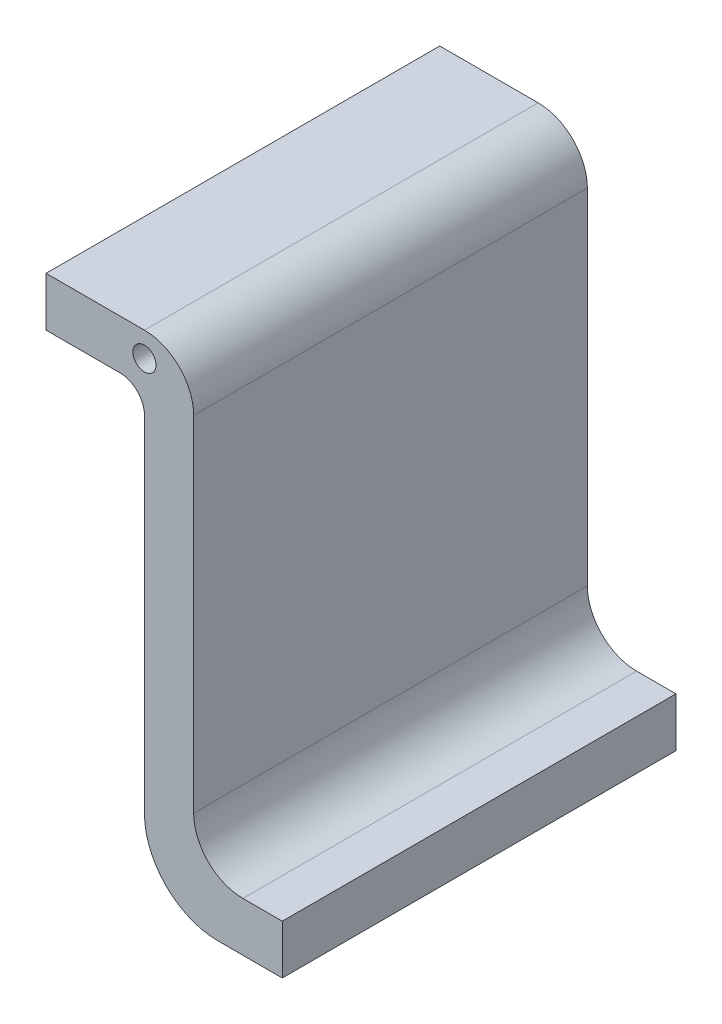
ISO-10303-21;
HEADER;
FILE_DESCRIPTION(('STEP AP214'),'2;1');
FILE_NAME('part.step','',(''),(''),'','','');
FILE_SCHEMA(('AUTOMOTIVE_DESIGN { 1 0 10303 214 1 1 1 1 }'));
ENDSEC;
DATA;
#1=APPLICATION_CONTEXT('core data for automotive mechanical design processes');
#2=APPLICATION_PROTOCOL_DEFINITION('international standard','automotive_design',2000,#1);
#3=PRODUCT_CONTEXT('',#1,'mechanical');
#4=PRODUCT('Part','Part','',(#3));
#5=PRODUCT_RELATED_PRODUCT_CATEGORY('part','',(#4));
#6=PRODUCT_DEFINITION_FORMATION('','',#4);
#7=PRODUCT_DEFINITION_CONTEXT('part definition',#1,'design');
#8=PRODUCT_DEFINITION('design','',#6,#7);
#9=PRODUCT_DEFINITION_SHAPE('','',#8);
#10=(LENGTH_UNIT() NAMED_UNIT(*) SI_UNIT(.MILLI.,.METRE.));
#11=(NAMED_UNIT(*) PLANE_ANGLE_UNIT() SI_UNIT($,.RADIAN.));
#12=(NAMED_UNIT(*) SI_UNIT($,.STERADIAN.) SOLID_ANGLE_UNIT());
#13=UNCERTAINTY_MEASURE_WITH_UNIT(LENGTH_MEASURE(1.E-05),#10,'distance_accuracy_value','');
#14=(GEOMETRIC_REPRESENTATION_CONTEXT(3) GLOBAL_UNCERTAINTY_ASSIGNED_CONTEXT((#13)) GLOBAL_UNIT_ASSIGNED_CONTEXT((#10,
#11,#12)) REPRESENTATION_CONTEXT('',''));
#15=CARTESIAN_POINT('',(0.,0.,0.));
#16=DIRECTION('',(0.,0.,1.));
#17=DIRECTION('',(1.,0.,0.));
#18=AXIS2_PLACEMENT_3D('',#15,#16,#17);
#19=CARTESIAN_POINT('',(0.,-10.,-80.));
#20=DIRECTION('',(-1.,0.,0.));
#21=DIRECTION('',(0.,0.,1.));
#22=AXIS2_PLACEMENT_3D('',#19,#20,#21);
#23=PLANE('',#22);
#24=DIRECTION('',(0.,-1.,0.));
#25=VECTOR('',#24,1.);
#26=CARTESIAN_POINT('',(0.,-10.,0.));
#27=LINE('',#26,#25);
#28=CARTESIAN_POINT('',(0.,0.,0.));
#29=VERTEX_POINT('',#28);
#30=CARTESIAN_POINT('',(0.,-10.,0.));
#31=VERTEX_POINT('',#30);
#32=EDGE_CURVE('E198',#29,#31,#27,.T.);
#33=ORIENTED_EDGE('',*,*,#32,.F.);
#34=DIRECTION('',(0.,0.,1.));
#35=VECTOR('',#34,1.);
#36=CARTESIAN_POINT('',(0.,0.,-80.));
#37=LINE('',#36,#35);
#38=CARTESIAN_POINT('',(0.,0.,-80.));
#39=VERTEX_POINT('',#38);
#40=EDGE_CURVE('E159',#39,#29,#37,.T.);
#41=ORIENTED_EDGE('',*,*,#40,.F.);
#42=DIRECTION('',(0.,-1.,0.));
#43=VECTOR('',#42,1.);
#44=CARTESIAN_POINT('',(0.,-10.,-80.));
#45=LINE('',#44,#43);
#46=CARTESIAN_POINT('',(0.,-10.,-80.));
#47=VERTEX_POINT('',#46);
#48=EDGE_CURVE('E153',#39,#47,#45,.T.);
#49=ORIENTED_EDGE('',*,*,#48,.T.);
#50=DIRECTION('',(0.,0.,1.));
#51=VECTOR('',#50,1.);
#52=CARTESIAN_POINT('',(0.,-10.,-80.));
#53=LINE('',#52,#51);
#54=EDGE_CURVE('E133',#47,#31,#53,.T.);
#55=ORIENTED_EDGE('',*,*,#54,.T.);
#56=EDGE_LOOP('',(#33,#41,#49,#55));
#57=FACE_BOUND('',#56,.T.);
#58=ADVANCED_FACE('F45',(#57),#23,.T.);
#59=CARTESIAN_POINT('',(0.,0.,-80.));
#60=DIRECTION('',(0.,1.,0.));
#61=DIRECTION('',(0.,0.,1.));
#62=AXIS2_PLACEMENT_3D('',#59,#60,#61);
#63=PLANE('',#62);
#64=DIRECTION('',(-1.,0.,0.));
#65=VECTOR('',#64,1.);
#66=CARTESIAN_POINT('',(0.,0.,0.));
#67=LINE('',#66,#65);
#68=CARTESIAN_POINT('',(19.9999999999999,0.,0.));
#69=VERTEX_POINT('',#68);
#70=EDGE_CURVE('E161',#69,#29,#67,.T.);
#71=ORIENTED_EDGE('',*,*,#70,.F.);
#72=DIRECTION('',(0.,0.,1.));
#73=VECTOR('',#72,1.);
#74=CARTESIAN_POINT('',(19.9999999999999,0.,-80.));
#75=LINE('',#74,#73);
#76=CARTESIAN_POINT('',(19.9999999999999,0.,-80.));
#77=VERTEX_POINT('',#76);
#78=EDGE_CURVE('E232',#77,#69,#75,.T.);
#79=ORIENTED_EDGE('',*,*,#78,.F.);
#80=DIRECTION('',(-1.,0.,0.));
#81=VECTOR('',#80,1.);
#82=CARTESIAN_POINT('',(0.,0.,-80.));
#83=LINE('',#82,#81);
#84=EDGE_CURVE('E146',#77,#39,#83,.T.);
#85=ORIENTED_EDGE('',*,*,#84,.T.);
#86=ORIENTED_EDGE('',*,*,#40,.T.);
#87=EDGE_LOOP('',(#71,#79,#85,#86));
#88=FACE_BOUND('',#87,.T.);
#89=ADVANCED_FACE('F273',(#88),#63,.T.);
#90=CARTESIAN_POINT('',(20.,-10.,-80.));
#91=DIRECTION('',(0.,0.,1.));
#92=DIRECTION('',(1.,0.,0.));
#93=AXIS2_PLACEMENT_3D('',#90,#91,#92);
#94=CYLINDRICAL_SURFACE('',#93,10.);
#95=CARTESIAN_POINT('',(20.,-10.,0.));
#96=DIRECTION('',(0.,0.,1.));
#97=DIRECTION('',(-1.,0.,0.));
#98=AXIS2_PLACEMENT_3D('',#95,#96,#97);
#99=CIRCLE('',#98,10.);
#100=CARTESIAN_POINT('',(30.,-10.0000000000001,0.));
#101=VERTEX_POINT('',#100);
#102=EDGE_CURVE('E165',#101,#69,#99,.T.);
#103=ORIENTED_EDGE('',*,*,#102,.F.);
#104=DIRECTION('',(0.,0.,1.));
#105=VECTOR('',#104,1.);
#106=CARTESIAN_POINT('',(30.,-10.0000000000001,-80.));
#107=LINE('',#106,#105);
#108=CARTESIAN_POINT('',(30.,-10.0000000000001,-80.));
#109=VERTEX_POINT('',#108);
#110=EDGE_CURVE('E235',#109,#101,#107,.T.);
#111=ORIENTED_EDGE('',*,*,#110,.F.);
#112=CARTESIAN_POINT('',(20.,-10.,-80.));
#113=DIRECTION('',(0.,0.,1.));
#114=DIRECTION('',(-1.,0.,0.));
#115=AXIS2_PLACEMENT_3D('',#112,#113,#114);
#116=CIRCLE('',#115,10.);
#117=EDGE_CURVE('E192',#109,#77,#116,.T.);
#118=ORIENTED_EDGE('',*,*,#117,.T.);
#119=ORIENTED_EDGE('',*,*,#78,.T.);
#120=EDGE_LOOP('',(#103,#111,#118,#119));
#121=FACE_BOUND('',#120,.T.);
#122=ADVANCED_FACE('F312',(#121),#94,.T.);
#123=CARTESIAN_POINT('',(30.,-10.0000000000001,-80.));
#124=DIRECTION('',(1.,0.,0.));
#125=DIRECTION('',(0.,1.,0.));
#126=AXIS2_PLACEMENT_3D('',#123,#124,#125);
#127=PLANE('',#126);
#128=DIRECTION('',(0.,1.,0.));
#129=VECTOR('',#128,1.);
#130=CARTESIAN_POINT('',(30.,-10.0000000000001,0.));
#131=LINE('',#130,#129);
#132=CARTESIAN_POINT('',(30.,-80.,0.));
#133=VERTEX_POINT('',#132);
#134=EDGE_CURVE('E222',#133,#101,#131,.T.);
#135=ORIENTED_EDGE('',*,*,#134,.F.);
#136=DIRECTION('',(0.,0.,1.));
#137=VECTOR('',#136,1.);
#138=CARTESIAN_POINT('',(30.,-80.,-80.));
#139=LINE('',#138,#137);
#140=CARTESIAN_POINT('',(30.,-80.,-80.));
#141=VERTEX_POINT('',#140);
#142=EDGE_CURVE('E238',#141,#133,#139,.T.);
#143=ORIENTED_EDGE('',*,*,#142,.F.);
#144=DIRECTION('',(0.,1.,0.));
#145=VECTOR('',#144,1.);
#146=CARTESIAN_POINT('',(30.,-10.0000000000001,-80.));
#147=LINE('',#146,#145);
#148=EDGE_CURVE('E188',#141,#109,#147,.T.);
#149=ORIENTED_EDGE('',*,*,#148,.T.);
#150=ORIENTED_EDGE('',*,*,#110,.T.);
#151=EDGE_LOOP('',(#135,#143,#149,#150));
#152=FACE_BOUND('',#151,.T.);
#153=ADVANCED_FACE('F280',(#152),#127,.T.);
#154=CARTESIAN_POINT('',(40.,-80.,-80.));
#155=DIRECTION('',(0.,0.,1.));
#156=DIRECTION('',(1.,0.,0.));
#157=AXIS2_PLACEMENT_3D('',#154,#155,#156);
#158=CYLINDRICAL_SURFACE('',#157,9.99999999999999);
#159=CARTESIAN_POINT('',(40.,-80.,0.));
#160=DIRECTION('',(0.,0.,-1.));
#161=DIRECTION('',(1.,0.,0.));
#162=AXIS2_PLACEMENT_3D('',#159,#160,#161);
#163=CIRCLE('',#162,9.99999999999999);
#164=CARTESIAN_POINT('',(40.,-90.,0.));
#165=VERTEX_POINT('',#164);
#166=EDGE_CURVE('E218',#165,#133,#163,.T.);
#167=ORIENTED_EDGE('',*,*,#166,.F.);
#168=DIRECTION('',(0.,0.,1.));
#169=VECTOR('',#168,1.);
#170=CARTESIAN_POINT('',(40.,-90.,-80.));
#171=LINE('',#170,#169);
#172=CARTESIAN_POINT('',(40.,-90.,-80.));
#173=VERTEX_POINT('',#172);
#174=EDGE_CURVE('E241',#173,#165,#171,.T.);
#175=ORIENTED_EDGE('',*,*,#174,.F.);
#176=CARTESIAN_POINT('',(40.,-80.,-80.));
#177=DIRECTION('',(0.,0.,-1.));
#178=DIRECTION('',(1.,0.,0.));
#179=AXIS2_PLACEMENT_3D('',#176,#177,#178);
#180=CIRCLE('',#179,9.99999999999999);
#181=EDGE_CURVE('E184',#173,#141,#180,.T.);
#182=ORIENTED_EDGE('',*,*,#181,.T.);
#183=ORIENTED_EDGE('',*,*,#142,.T.);
#184=EDGE_LOOP('',(#167,#175,#182,#183));
#185=FACE_BOUND('',#184,.T.);
#186=ADVANCED_FACE('F283',(#185),#158,.F.);
#187=CARTESIAN_POINT('',(40.,-90.,-80.));
#188=DIRECTION('',(0.,1.,0.));
#189=DIRECTION('',(0.,0.,1.));
#190=AXIS2_PLACEMENT_3D('',#187,#188,#189);
#191=PLANE('',#190);
#192=DIRECTION('',(-1.,0.,0.));
#193=VECTOR('',#192,1.);
#194=CARTESIAN_POINT('',(40.,-90.,0.));
#195=LINE('',#194,#193);
#196=CARTESIAN_POINT('',(48.,-90.,0.));
#197=VERTEX_POINT('',#196);
#198=EDGE_CURVE('E214',#197,#165,#195,.T.);
#199=ORIENTED_EDGE('',*,*,#198,.F.);
#200=DIRECTION('',(0.,0.,1.));
#201=VECTOR('',#200,1.);
#202=CARTESIAN_POINT('',(48.,-90.,-80.));
#203=LINE('',#202,#201);
#204=CARTESIAN_POINT('',(48.,-90.,-80.));
#205=VERTEX_POINT('',#204);
#206=EDGE_CURVE('E244',#205,#197,#203,.T.);
#207=ORIENTED_EDGE('',*,*,#206,.F.);
#208=DIRECTION('',(-1.,0.,0.));
#209=VECTOR('',#208,1.);
#210=CARTESIAN_POINT('',(40.,-90.,-80.));
#211=LINE('',#210,#209);
#212=EDGE_CURVE('E180',#205,#173,#211,.T.);
#213=ORIENTED_EDGE('',*,*,#212,.T.);
#214=ORIENTED_EDGE('',*,*,#174,.T.);
#215=EDGE_LOOP('',(#199,#207,#213,#214));
#216=FACE_BOUND('',#215,.T.);
#217=ADVANCED_FACE('F288',(#216),#191,.T.);
#218=CARTESIAN_POINT('',(48.,-100.,-80.));
#219=DIRECTION('',(1.,0.,0.));
#220=DIRECTION('',(0.,0.,-1.));
#221=AXIS2_PLACEMENT_3D('',#218,#219,#220);
#222=PLANE('',#221);
#223=DIRECTION('',(0.,1.,0.));
#224=VECTOR('',#223,1.);
#225=CARTESIAN_POINT('',(48.,-100.,0.));
#226=LINE('',#225,#224);
#227=CARTESIAN_POINT('',(48.,-100.,0.));
#228=VERTEX_POINT('',#227);
#229=EDGE_CURVE('E210',#228,#197,#226,.T.);
#230=ORIENTED_EDGE('',*,*,#229,.F.);
#231=DIRECTION('',(0.,0.,1.));
#232=VECTOR('',#231,1.);
#233=CARTESIAN_POINT('',(48.,-100.,-80.));
#234=LINE('',#233,#232);
#235=CARTESIAN_POINT('',(48.,-100.,-80.));
#236=VERTEX_POINT('',#235);
#237=EDGE_CURVE('E145',#236,#228,#234,.T.);
#238=ORIENTED_EDGE('',*,*,#237,.F.);
#239=DIRECTION('',(0.,1.,0.));
#240=VECTOR('',#239,1.);
#241=CARTESIAN_POINT('',(48.,-100.,-80.));
#242=LINE('',#241,#240);
#243=EDGE_CURVE('E176',#236,#205,#242,.T.);
#244=ORIENTED_EDGE('',*,*,#243,.T.);
#245=ORIENTED_EDGE('',*,*,#206,.T.);
#246=EDGE_LOOP('',(#230,#238,#244,#245));
#247=FACE_BOUND('',#246,.T.);
#248=ADVANCED_FACE('F291',(#247),#222,.T.);
#249=CARTESIAN_POINT('',(48.,-100.,-80.));
#250=DIRECTION('',(0.,-1.,0.));
#251=DIRECTION('',(0.,0.,-1.));
#252=AXIS2_PLACEMENT_3D('',#249,#250,#251);
#253=PLANE('',#252);
#254=DIRECTION('',(1.,0.,0.));
#255=VECTOR('',#254,1.);
#256=CARTESIAN_POINT('',(48.,-100.,0.));
#257=LINE('',#256,#255);
#258=CARTESIAN_POINT('',(35.,-100.,0.));
#259=VERTEX_POINT('',#258);
#260=EDGE_CURVE('E207',#259,#228,#257,.T.);
#261=ORIENTED_EDGE('',*,*,#260,.F.);
#262=DIRECTION('',(0.,0.,1.));
#263=VECTOR('',#262,1.);
#264=CARTESIAN_POINT('',(35.,-100.,-80.));
#265=LINE('',#264,#263);
#266=CARTESIAN_POINT('',(35.,-100.,-80.));
#267=VERTEX_POINT('',#266);
#268=EDGE_CURVE('E256',#259,#267,#265,.F.);
#269=ORIENTED_EDGE('',*,*,#268,.T.);
#270=DIRECTION('',(1.,0.,0.));
#271=VECTOR('',#270,1.);
#272=CARTESIAN_POINT('',(48.,-100.,-80.));
#273=LINE('',#272,#271);
#274=EDGE_CURVE('E173',#267,#236,#273,.T.);
#275=ORIENTED_EDGE('',*,*,#274,.T.);
#276=ORIENTED_EDGE('',*,*,#237,.T.);
#277=EDGE_LOOP('',(#261,#269,#275,#276));
#278=FACE_BOUND('',#277,.T.);
#279=ADVANCED_FACE('F319',(#278),#253,.T.);
#280=CARTESIAN_POINT('',(20.,-100.,-80.));
#281=DIRECTION('',(-1.,0.,0.));
#282=DIRECTION('',(0.,-1.,0.));
#283=AXIS2_PLACEMENT_3D('',#280,#281,#282);
#284=PLANE('',#283);
#285=DIRECTION('',(0.,-1.,0.));
#286=VECTOR('',#285,1.);
#287=CARTESIAN_POINT('',(20.,-100.,0.));
#288=LINE('',#287,#286);
#289=CARTESIAN_POINT('',(20.,-15.,0.));
#290=VERTEX_POINT('',#289);
#291=CARTESIAN_POINT('',(20.,-85.,0.));
#292=VERTEX_POINT('',#291);
#293=EDGE_CURVE('E204',#290,#292,#288,.T.);
#294=ORIENTED_EDGE('',*,*,#293,.F.);
#295=DIRECTION('',(0.,0.,1.));
#296=VECTOR('',#295,1.);
#297=CARTESIAN_POINT('',(20.,-15.,-80.));
#298=LINE('',#297,#296);
#299=CARTESIAN_POINT('',(20.,-15.,-80.));
#300=VERTEX_POINT('',#299);
#301=EDGE_CURVE('E67',#290,#300,#298,.F.);
#302=ORIENTED_EDGE('',*,*,#301,.T.);
#303=DIRECTION('',(0.,-1.,0.));
#304=VECTOR('',#303,1.);
#305=CARTESIAN_POINT('',(20.,-100.,-80.));
#306=LINE('',#305,#304);
#307=CARTESIAN_POINT('',(20.,-85.,-80.));
#308=VERTEX_POINT('',#307);
#309=EDGE_CURVE('E157',#300,#308,#306,.T.);
#310=ORIENTED_EDGE('',*,*,#309,.T.);
#311=DIRECTION('',(0.,0.,1.));
#312=VECTOR('',#311,1.);
#313=CARTESIAN_POINT('',(20.,-85.,-80.));
#314=LINE('',#313,#312);
#315=EDGE_CURVE('E231',#308,#292,#314,.T.);
#316=ORIENTED_EDGE('',*,*,#315,.T.);
#317=EDGE_LOOP('',(#294,#302,#310,#316));
#318=FACE_BOUND('',#317,.T.);
#319=ADVANCED_FACE('F300',(#318),#284,.T.);
#320=CARTESIAN_POINT('',(20.,-10.,-80.));
#321=DIRECTION('',(0.,-1.,0.));
#322=DIRECTION('',(1.,0.,0.));
#323=AXIS2_PLACEMENT_3D('',#320,#321,#322);
#324=PLANE('',#323);
#325=DIRECTION('',(1.,0.,0.));
#326=VECTOR('',#325,1.);
#327=CARTESIAN_POINT('',(20.,-10.,-80.));
#328=LINE('',#327,#326);
#329=CARTESIAN_POINT('',(15.,-10.,-80.));
#330=VERTEX_POINT('',#329);
#331=EDGE_CURVE('E137',#47,#330,#328,.T.);
#332=ORIENTED_EDGE('',*,*,#331,.T.);
#333=DIRECTION('',(0.,0.,1.));
#334=VECTOR('',#333,1.);
#335=CARTESIAN_POINT('',(15.,-10.,0.));
#336=LINE('',#335,#334);
#337=CARTESIAN_POINT('',(15.,-10.,0.));
#338=VERTEX_POINT('',#337);
#339=EDGE_CURVE('E263',#330,#338,#336,.T.);
#340=ORIENTED_EDGE('',*,*,#339,.T.);
#341=DIRECTION('',(1.,0.,0.));
#342=VECTOR('',#341,1.);
#343=CARTESIAN_POINT('',(20.,-10.,0.));
#344=LINE('',#343,#342);
#345=EDGE_CURVE('E139',#31,#338,#344,.T.);
#346=ORIENTED_EDGE('',*,*,#345,.F.);
#347=ORIENTED_EDGE('',*,*,#54,.F.);
#348=EDGE_LOOP('',(#332,#340,#346,#347));
#349=FACE_BOUND('',#348,.T.);
#350=ADVANCED_FACE('F135',(#349),#324,.T.);
#351=CARTESIAN_POINT('',(20.,-10.,-80.));
#352=DIRECTION('',(0.,0.,-1.));
#353=DIRECTION('',(-1.,0.,0.));
#354=AXIS2_PLACEMENT_3D('',#351,#352,#353);
#355=PLANE('',#354);
#356=CARTESIAN_POINT('',(20.,-5.,-80.));
#357=DIRECTION('',(0.,0.,-1.));
#358=DIRECTION('',(-1.,0.,0.));
#359=AXIS2_PLACEMENT_3D('',#356,#357,#358);
#360=CIRCLE('',#359,2.35);
#361=CARTESIAN_POINT('',(17.65,-5.,-80.));
#362=VERTEX_POINT('',#361);
#363=EDGE_CURVE('E357',#362,#362,#360,.T.);
#364=ORIENTED_EDGE('',*,*,#363,.F.);
#365=EDGE_LOOP('',(#364));
#366=FACE_BOUND('',#365,.T.);
#367=ORIENTED_EDGE('',*,*,#274,.F.);
#368=CARTESIAN_POINT('',(35.,-85.,-80.));
#369=DIRECTION('',(0.,0.,-1.));
#370=DIRECTION('',(-1.,0.,0.));
#371=AXIS2_PLACEMENT_3D('',#368,#369,#370);
#372=CIRCLE('',#371,15.);
#373=EDGE_CURVE('E259',#267,#308,#372,.T.);
#374=ORIENTED_EDGE('',*,*,#373,.T.);
#375=ORIENTED_EDGE('',*,*,#309,.F.);
#376=CARTESIAN_POINT('',(15.,-15.,-80.));
#377=DIRECTION('',(0.,0.,-1.));
#378=DIRECTION('',(-1.,0.,0.));
#379=AXIS2_PLACEMENT_3D('',#376,#377,#378);
#380=CIRCLE('',#379,5.);
#381=EDGE_CURVE('E11',#300,#330,#380,.F.);
#382=ORIENTED_EDGE('',*,*,#381,.T.);
#383=ORIENTED_EDGE('',*,*,#331,.F.);
#384=ORIENTED_EDGE('',*,*,#48,.F.);
#385=ORIENTED_EDGE('',*,*,#84,.F.);
#386=ORIENTED_EDGE('',*,*,#117,.F.);
#387=ORIENTED_EDGE('',*,*,#148,.F.);
#388=ORIENTED_EDGE('',*,*,#181,.F.);
#389=ORIENTED_EDGE('',*,*,#212,.F.);
#390=ORIENTED_EDGE('',*,*,#243,.F.);
#391=EDGE_LOOP('',(#367,#374,#375,#382,#383,#384,#385,#386,#387,#388,#389,#390));
#392=FACE_BOUND('',#391,.T.);
#393=ADVANCED_FACE('F151',(#366,#392),#355,.T.);
#394=CARTESIAN_POINT('',(20.,-10.,0.));
#395=DIRECTION('',(0.,0.,-1.));
#396=DIRECTION('',(-1.,0.,0.));
#397=AXIS2_PLACEMENT_3D('',#394,#395,#396);
#398=PLANE('',#397);
#399=CARTESIAN_POINT('',(20.,-5.,0.));
#400=DIRECTION('',(0.,0.,1.));
#401=DIRECTION('',(1.,0.,0.));
#402=AXIS2_PLACEMENT_3D('',#399,#400,#401);
#403=CIRCLE('',#402,2.35);
#404=CARTESIAN_POINT('',(22.35,-5.,0.));
#405=VERTEX_POINT('',#404);
#406=EDGE_CURVE('E168',#405,#405,#403,.T.);
#407=ORIENTED_EDGE('',*,*,#406,.F.);
#408=EDGE_LOOP('',(#407));
#409=FACE_BOUND('',#408,.T.);
#410=ORIENTED_EDGE('',*,*,#345,.T.);
#411=CARTESIAN_POINT('',(15.,-15.,0.));
#412=DIRECTION('',(0.,0.,-1.));
#413=DIRECTION('',(-1.,0.,0.));
#414=AXIS2_PLACEMENT_3D('',#411,#412,#413);
#415=CIRCLE('',#414,5.);
#416=EDGE_CURVE('E54',#338,#290,#415,.T.);
#417=ORIENTED_EDGE('',*,*,#416,.T.);
#418=ORIENTED_EDGE('',*,*,#293,.T.);
#419=CARTESIAN_POINT('',(35.,-85.,0.));
#420=DIRECTION('',(0.,0.,-1.));
#421=DIRECTION('',(-1.,0.,0.));
#422=AXIS2_PLACEMENT_3D('',#419,#420,#421);
#423=CIRCLE('',#422,15.);
#424=EDGE_CURVE('E253',#292,#259,#423,.F.);
#425=ORIENTED_EDGE('',*,*,#424,.T.);
#426=ORIENTED_EDGE('',*,*,#260,.T.);
#427=ORIENTED_EDGE('',*,*,#229,.T.);
#428=ORIENTED_EDGE('',*,*,#198,.T.);
#429=ORIENTED_EDGE('',*,*,#166,.T.);
#430=ORIENTED_EDGE('',*,*,#134,.T.);
#431=ORIENTED_EDGE('',*,*,#102,.T.);
#432=ORIENTED_EDGE('',*,*,#70,.T.);
#433=ORIENTED_EDGE('',*,*,#32,.T.);
#434=EDGE_LOOP('',(#410,#417,#418,#425,#426,#427,#428,#429,#430,#431,#432,#433));
#435=FACE_BOUND('',#434,.T.);
#436=ADVANCED_FACE('F269',(#409,#435),#398,.F.);
#437=CARTESIAN_POINT('',(20.,-5.,-5.));
#438=DIRECTION('',(0.,0.,1.));
#439=DIRECTION('',(1.,0.,0.));
#440=AXIS2_PLACEMENT_3D('',#437,#438,#439);
#441=CYLINDRICAL_SURFACE('',#440,2.35);
#442=CARTESIAN_POINT('',(20.,-5.,-5.));
#443=DIRECTION('',(0.,0.,1.));
#444=DIRECTION('',(1.,0.,0.));
#445=AXIS2_PLACEMENT_3D('',#442,#443,#444);
#446=CIRCLE('',#445,2.35);
#447=CARTESIAN_POINT('',(22.35,-5.,-5.));
#448=VERTEX_POINT('',#447);
#449=EDGE_CURVE('E201',#448,#448,#446,.T.);
#450=ORIENTED_EDGE('',*,*,#449,.F.);
#451=EDGE_LOOP('',(#450));
#452=FACE_BOUND('',#451,.T.);
#453=ORIENTED_EDGE('',*,*,#406,.T.);
#454=EDGE_LOOP('',(#453));
#455=FACE_BOUND('',#454,.T.);
#456=ADVANCED_FACE('F333',(#452,#455),#441,.F.);
#457=CARTESIAN_POINT('',(20.,-5.,-5.));
#458=DIRECTION('',(0.,0.,1.));
#459=DIRECTION('',(1.,0.,0.));
#460=AXIS2_PLACEMENT_3D('',#457,#458,#459);
#461=PLANE('',#460);
#462=ORIENTED_EDGE('',*,*,#449,.T.);
#463=EDGE_LOOP('',(#462));
#464=FACE_BOUND('',#463,.T.);
#465=ADVANCED_FACE('F340',(#464),#461,.T.);
#466=CARTESIAN_POINT('',(20.,-5.,-75.));
#467=DIRECTION('',(0.,0.,-1.));
#468=DIRECTION('',(-1.,0.,0.));
#469=AXIS2_PLACEMENT_3D('',#466,#467,#468);
#470=CYLINDRICAL_SURFACE('',#469,2.35);
#471=CARTESIAN_POINT('',(20.,-5.,-75.));
#472=DIRECTION('',(0.,0.,-1.));
#473=DIRECTION('',(-1.,0.,0.));
#474=AXIS2_PLACEMENT_3D('',#471,#472,#473);
#475=CIRCLE('',#474,2.35);
#476=CARTESIAN_POINT('',(17.65,-5.,-75.));
#477=VERTEX_POINT('',#476);
#478=EDGE_CURVE('E355',#477,#477,#475,.T.);
#479=ORIENTED_EDGE('',*,*,#478,.F.);
#480=EDGE_LOOP('',(#479));
#481=FACE_BOUND('',#480,.T.);
#482=ORIENTED_EDGE('',*,*,#363,.T.);
#483=EDGE_LOOP('',(#482));
#484=FACE_BOUND('',#483,.T.);
#485=ADVANCED_FACE('F344',(#481,#484),#470,.F.);
#486=CARTESIAN_POINT('',(20.,-5.,-75.));
#487=DIRECTION('',(0.,0.,-1.));
#488=DIRECTION('',(-1.,0.,0.));
#489=AXIS2_PLACEMENT_3D('',#486,#487,#488);
#490=PLANE('',#489);
#491=ORIENTED_EDGE('',*,*,#478,.T.);
#492=EDGE_LOOP('',(#491));
#493=FACE_BOUND('',#492,.T.);
#494=ADVANCED_FACE('F306',(#493),#490,.T.);
#495=CARTESIAN_POINT('',(35.,-85.,-80.));
#496=DIRECTION('',(0.,0.,1.));
#497=DIRECTION('',(1.,0.,0.));
#498=AXIS2_PLACEMENT_3D('',#495,#496,#497);
#499=CYLINDRICAL_SURFACE('',#498,15.);
#500=ORIENTED_EDGE('',*,*,#373,.F.);
#501=ORIENTED_EDGE('',*,*,#268,.F.);
#502=ORIENTED_EDGE('',*,*,#424,.F.);
#503=ORIENTED_EDGE('',*,*,#315,.F.);
#504=EDGE_LOOP('',(#500,#501,#502,#503));
#505=FACE_BOUND('',#504,.T.);
#506=ADVANCED_FACE('F298',(#505),#499,.T.);
#507=CARTESIAN_POINT('',(15.,-15.,-80.));
#508=DIRECTION('',(0.,0.,-1.));
#509=DIRECTION('',(-1.,0.,0.));
#510=AXIS2_PLACEMENT_3D('',#507,#508,#509);
#511=CYLINDRICAL_SURFACE('',#510,5.);
#512=ORIENTED_EDGE('',*,*,#381,.F.);
#513=ORIENTED_EDGE('',*,*,#301,.F.);
#514=ORIENTED_EDGE('',*,*,#416,.F.);
#515=ORIENTED_EDGE('',*,*,#339,.F.);
#516=EDGE_LOOP('',(#512,#513,#514,#515));
#517=FACE_BOUND('',#516,.T.);
#518=ADVANCED_FACE('F47',(#517),#511,.F.);
#519=CLOSED_SHELL('',(#58,#89,#122,#153,#186,#217,#248,#279,#319,#350,#393,#436,#456,#465,#485,
#494,#506,#518));
#520=MANIFOLD_SOLID_BREP('B2',#519);
#521=ADVANCED_BREP_SHAPE_REPRESENTATION('',(#18,#520),#14);
#522=SHAPE_DEFINITION_REPRESENTATION(#9,#521);
ENDSEC;
END-ISO-10303-21;
